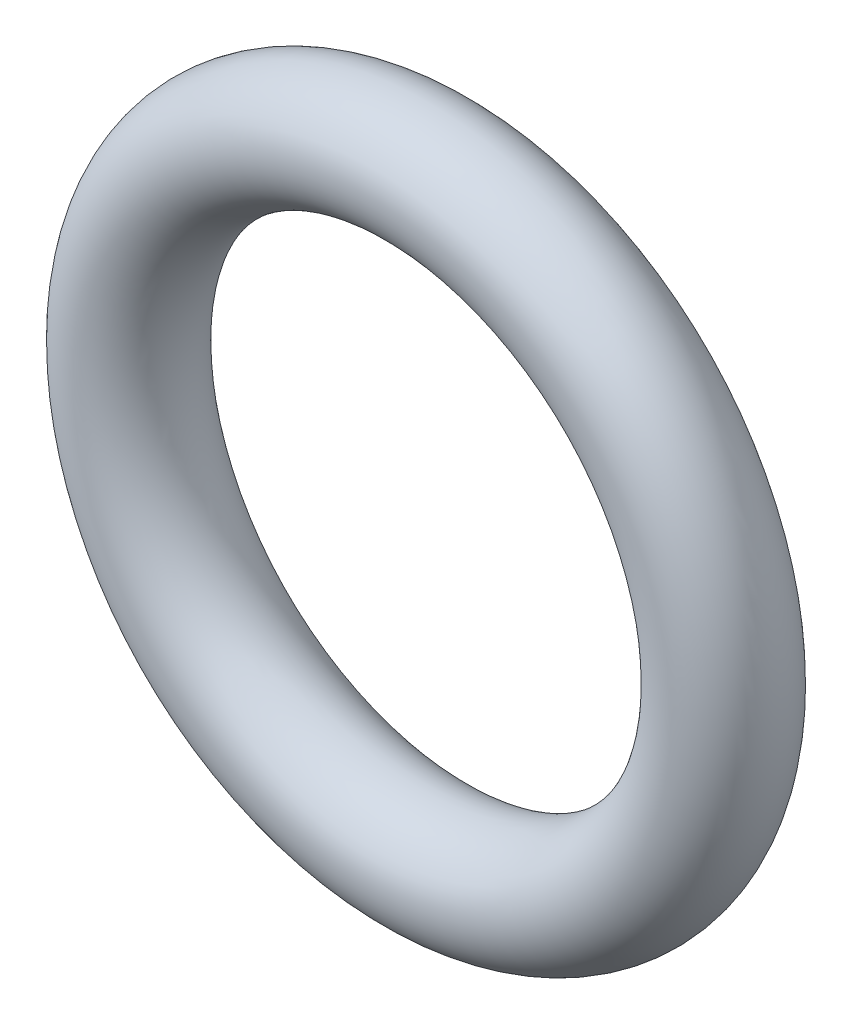
ISO-10303-21;
HEADER;
FILE_DESCRIPTION(('STEP AP214'),'2;1');
FILE_NAME('part.step','',(''),(''),'','','');
FILE_SCHEMA(('AUTOMOTIVE_DESIGN { 1 0 10303 214 1 1 1 1 }'));
ENDSEC;
DATA;
#1=APPLICATION_CONTEXT('core data for automotive mechanical design processes');
#2=APPLICATION_PROTOCOL_DEFINITION('international standard','automotive_design',2000,#1);
#3=PRODUCT_CONTEXT('',#1,'mechanical');
#4=PRODUCT('Part','Part','',(#3));
#5=PRODUCT_RELATED_PRODUCT_CATEGORY('part','',(#4));
#6=PRODUCT_DEFINITION_FORMATION('','',#4);
#7=PRODUCT_DEFINITION_CONTEXT('part definition',#1,'design');
#8=PRODUCT_DEFINITION('design','',#6,#7);
#9=PRODUCT_DEFINITION_SHAPE('','',#8);
#10=(LENGTH_UNIT() NAMED_UNIT(*) SI_UNIT(.MILLI.,.METRE.));
#11=(NAMED_UNIT(*) PLANE_ANGLE_UNIT() SI_UNIT($,.RADIAN.));
#12=(NAMED_UNIT(*) SI_UNIT($,.STERADIAN.) SOLID_ANGLE_UNIT());
#13=UNCERTAINTY_MEASURE_WITH_UNIT(LENGTH_MEASURE(1.E-05),#10,'distance_accuracy_value','');
#14=(GEOMETRIC_REPRESENTATION_CONTEXT(3) GLOBAL_UNCERTAINTY_ASSIGNED_CONTEXT((#13)) GLOBAL_UNIT_ASSIGNED_CONTEXT((#10,
#11,#12)) REPRESENTATION_CONTEXT('',''));
#15=CARTESIAN_POINT('',(0.,0.,0.));
#16=DIRECTION('',(0.,0.,1.));
#17=DIRECTION('',(1.,0.,0.));
#18=AXIS2_PLACEMENT_3D('',#15,#16,#17);
#19=CARTESIAN_POINT('',(0.,0.,0.));
#20=DIRECTION('',(0.,0.,1.));
#21=DIRECTION('',(1.,0.,0.));
#22=AXIS2_PLACEMENT_3D('',#19,#20,#21);
#23=TOROIDAL_SURFACE('',#22,6.6929,1.3081);
#24=CARTESIAN_POINT('',(8.001,0.,0.));
#25=VERTEX_POINT('',#24);
#26=VERTEX_LOOP('',#25);
#27=FACE_BOUND('',#26,.T.);
#28=ADVANCED_FACE('F30',(#27),#23,.T.);
#29=CLOSED_SHELL('',(#28));
#30=MANIFOLD_SOLID_BREP('B2',#29);
#31=ADVANCED_BREP_SHAPE_REPRESENTATION('',(#18,#30),#14);
#32=SHAPE_DEFINITION_REPRESENTATION(#9,#31);
ENDSEC;
END-ISO-10303-21;
